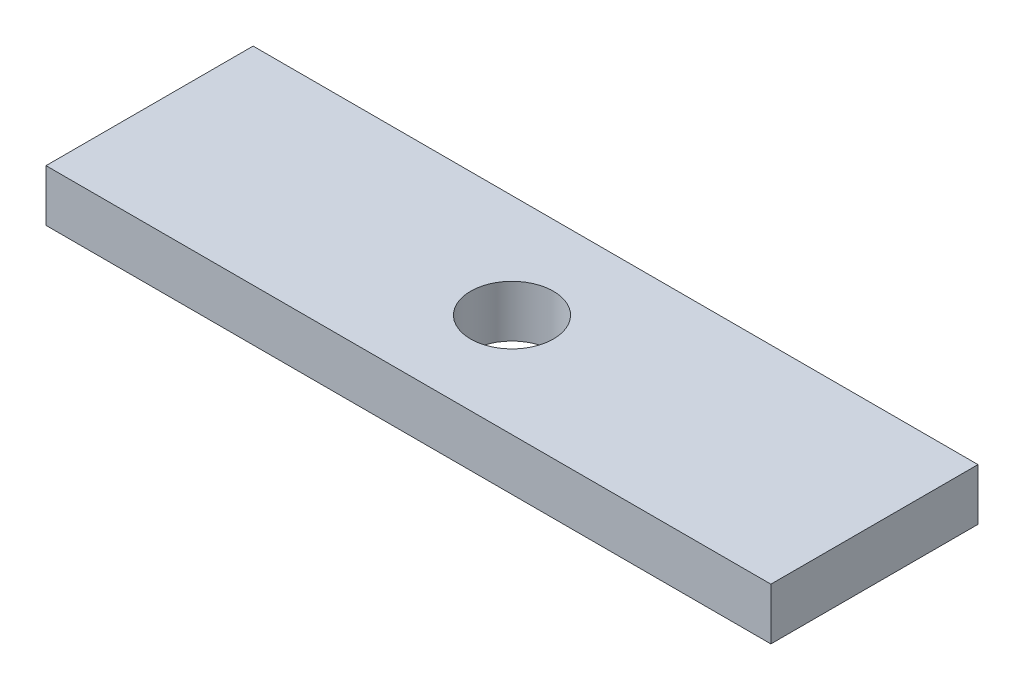
ISO-10303-21;
HEADER;
FILE_DESCRIPTION(('STEP AP214'),'2;1');
FILE_NAME('part.step','',(''),(''),'','','');
FILE_SCHEMA(('AUTOMOTIVE_DESIGN { 1 0 10303 214 1 1 1 1 }'));
ENDSEC;
DATA;
#1=APPLICATION_CONTEXT('core data for automotive mechanical design processes');
#2=APPLICATION_PROTOCOL_DEFINITION('international standard','automotive_design',2000,#1);
#3=PRODUCT_CONTEXT('',#1,'mechanical');
#4=PRODUCT('Part','Part','',(#3));
#5=PRODUCT_RELATED_PRODUCT_CATEGORY('part','',(#4));
#6=PRODUCT_DEFINITION_FORMATION('','',#4);
#7=PRODUCT_DEFINITION_CONTEXT('part definition',#1,'design');
#8=PRODUCT_DEFINITION('design','',#6,#7);
#9=PRODUCT_DEFINITION_SHAPE('','',#8);
#10=(LENGTH_UNIT() NAMED_UNIT(*) SI_UNIT(.MILLI.,.METRE.));
#11=(NAMED_UNIT(*) PLANE_ANGLE_UNIT() SI_UNIT($,.RADIAN.));
#12=(NAMED_UNIT(*) SI_UNIT($,.STERADIAN.) SOLID_ANGLE_UNIT());
#13=UNCERTAINTY_MEASURE_WITH_UNIT(LENGTH_MEASURE(1.E-05),#10,'distance_accuracy_value','');
#14=(GEOMETRIC_REPRESENTATION_CONTEXT(3) GLOBAL_UNCERTAINTY_ASSIGNED_CONTEXT((#13)) GLOBAL_UNIT_ASSIGNED_CONTEXT((#10,
#11,#12)) REPRESENTATION_CONTEXT('',''));
#15=CARTESIAN_POINT('',(0.,0.,0.));
#16=DIRECTION('',(0.,0.,1.));
#17=DIRECTION('',(1.,0.,0.));
#18=AXIS2_PLACEMENT_3D('',#15,#16,#17);
#19=CARTESIAN_POINT('',(0.,5.,0.));
#20=DIRECTION('',(0.,1.,0.));
#21=DIRECTION('',(0.,0.,1.));
#22=AXIS2_PLACEMENT_3D('',#19,#20,#21);
#23=PLANE('',#22);
#24=DIRECTION('',(0.,0.,-1.));
#25=VECTOR('',#24,1.);
#26=CARTESIAN_POINT('',(70.,5.,-20.));
#27=LINE('',#26,#25);
#28=CARTESIAN_POINT('',(70.,5.,20.));
#29=VERTEX_POINT('',#28);
#30=CARTESIAN_POINT('',(70.,5.,-20.));
#31=VERTEX_POINT('',#30);
#32=EDGE_CURVE('E87',#29,#31,#27,.T.);
#33=ORIENTED_EDGE('',*,*,#32,.T.);
#34=DIRECTION('',(-1.,0.,0.));
#35=VECTOR('',#34,1.);
#36=CARTESIAN_POINT('',(-70.,5.,-20.));
#37=LINE('',#36,#35);
#38=CARTESIAN_POINT('',(-70.,5.,-20.));
#39=VERTEX_POINT('',#38);
#40=EDGE_CURVE('E82',#31,#39,#37,.T.);
#41=ORIENTED_EDGE('',*,*,#40,.T.);
#42=DIRECTION('',(0.,0.,1.));
#43=VECTOR('',#42,1.);
#44=CARTESIAN_POINT('',(-70.,5.,-20.));
#45=LINE('',#44,#43);
#46=CARTESIAN_POINT('',(-70.,5.,20.));
#47=VERTEX_POINT('',#46);
#48=EDGE_CURVE('E85',#39,#47,#45,.T.);
#49=ORIENTED_EDGE('',*,*,#48,.T.);
#50=DIRECTION('',(1.,0.,0.));
#51=VECTOR('',#50,1.);
#52=CARTESIAN_POINT('',(-70.,5.,20.));
#53=LINE('',#52,#51);
#54=EDGE_CURVE('E52',#47,#29,#53,.T.);
#55=ORIENTED_EDGE('',*,*,#54,.T.);
#56=EDGE_LOOP('',(#33,#41,#49,#55));
#57=FACE_BOUND('',#56,.T.);
#58=CARTESIAN_POINT('',(0.,5.,0.));
#59=DIRECTION('',(0.,1.,0.));
#60=DIRECTION('',(0.,0.,1.));
#61=AXIS2_PLACEMENT_3D('',#58,#59,#60);
#62=CIRCLE('',#61,8.);
#63=CARTESIAN_POINT('',(0.,5.,7.99999999999999));
#64=VERTEX_POINT('',#63);
#65=EDGE_CURVE('E102',#64,#64,#62,.T.);
#66=ORIENTED_EDGE('',*,*,#65,.F.);
#67=EDGE_LOOP('',(#66));
#68=FACE_BOUND('',#67,.T.);
#69=ADVANCED_FACE('F35',(#57,#68),#23,.T.);
#70=CARTESIAN_POINT('',(0.,-5.,0.));
#71=DIRECTION('',(0.,1.,0.));
#72=DIRECTION('',(0.,0.,1.));
#73=AXIS2_PLACEMENT_3D('',#70,#71,#72);
#74=PLANE('',#73);
#75=DIRECTION('',(0.,0.,-1.));
#76=VECTOR('',#75,1.);
#77=CARTESIAN_POINT('',(70.,-5.,-20.));
#78=LINE('',#77,#76);
#79=CARTESIAN_POINT('',(70.,-5.,20.));
#80=VERTEX_POINT('',#79);
#81=CARTESIAN_POINT('',(70.,-5.,-20.));
#82=VERTEX_POINT('',#81);
#83=EDGE_CURVE('E99',#80,#82,#78,.T.);
#84=ORIENTED_EDGE('',*,*,#83,.F.);
#85=DIRECTION('',(1.,0.,0.));
#86=VECTOR('',#85,1.);
#87=CARTESIAN_POINT('',(-70.,-5.,20.));
#88=LINE('',#87,#86);
#89=CARTESIAN_POINT('',(-70.,-5.,20.));
#90=VERTEX_POINT('',#89);
#91=EDGE_CURVE('E75',#90,#80,#88,.T.);
#92=ORIENTED_EDGE('',*,*,#91,.F.);
#93=DIRECTION('',(0.,0.,1.));
#94=VECTOR('',#93,1.);
#95=CARTESIAN_POINT('',(-70.,-5.,-20.));
#96=LINE('',#95,#94);
#97=CARTESIAN_POINT('',(-70.,-5.,-20.));
#98=VERTEX_POINT('',#97);
#99=EDGE_CURVE('E69',#98,#90,#96,.T.);
#100=ORIENTED_EDGE('',*,*,#99,.F.);
#101=DIRECTION('',(-1.,0.,0.));
#102=VECTOR('',#101,1.);
#103=CARTESIAN_POINT('',(-70.,-5.,-20.));
#104=LINE('',#103,#102);
#105=EDGE_CURVE('E91',#82,#98,#104,.T.);
#106=ORIENTED_EDGE('',*,*,#105,.F.);
#107=EDGE_LOOP('',(#84,#92,#100,#106));
#108=FACE_BOUND('',#107,.T.);
#109=CARTESIAN_POINT('',(0.,-5.,0.));
#110=DIRECTION('',(0.,1.,0.));
#111=DIRECTION('',(0.,0.,1.));
#112=AXIS2_PLACEMENT_3D('',#109,#110,#111);
#113=CIRCLE('',#112,8.);
#114=CARTESIAN_POINT('',(0.,-5.,7.99999999999999));
#115=VERTEX_POINT('',#114);
#116=EDGE_CURVE('E114',#115,#115,#113,.T.);
#117=ORIENTED_EDGE('',*,*,#116,.T.);
#118=EDGE_LOOP('',(#117));
#119=FACE_BOUND('',#118,.T.);
#120=ADVANCED_FACE('F110',(#108,#119),#74,.F.);
#121=CARTESIAN_POINT('',(70.,5.,-20.));
#122=DIRECTION('',(-1.,0.,0.));
#123=DIRECTION('',(0.,0.,1.));
#124=AXIS2_PLACEMENT_3D('',#121,#122,#123);
#125=PLANE('',#124);
#126=ORIENTED_EDGE('',*,*,#83,.T.);
#127=DIRECTION('',(0.,-1.,0.));
#128=VECTOR('',#127,1.);
#129=CARTESIAN_POINT('',(70.,5.,-20.));
#130=LINE('',#129,#128);
#131=EDGE_CURVE('E11',#31,#82,#130,.T.);
#132=ORIENTED_EDGE('',*,*,#131,.F.);
#133=ORIENTED_EDGE('',*,*,#32,.F.);
#134=DIRECTION('',(0.,-1.,0.));
#135=VECTOR('',#134,1.);
#136=CARTESIAN_POINT('',(70.,5.,20.));
#137=LINE('',#136,#135);
#138=EDGE_CURVE('E95',#29,#80,#137,.T.);
#139=ORIENTED_EDGE('',*,*,#138,.T.);
#140=EDGE_LOOP('',(#126,#132,#133,#139));
#141=FACE_BOUND('',#140,.T.);
#142=ADVANCED_FACE('F37',(#141),#125,.F.);
#143=CARTESIAN_POINT('',(-70.,5.,-20.));
#144=DIRECTION('',(0.,0.,1.));
#145=DIRECTION('',(1.,0.,0.));
#146=AXIS2_PLACEMENT_3D('',#143,#144,#145);
#147=PLANE('',#146);
#148=ORIENTED_EDGE('',*,*,#105,.T.);
#149=DIRECTION('',(0.,-1.,0.));
#150=VECTOR('',#149,1.);
#151=CARTESIAN_POINT('',(-70.,5.,-20.));
#152=LINE('',#151,#150);
#153=EDGE_CURVE('E44',#39,#98,#152,.T.);
#154=ORIENTED_EDGE('',*,*,#153,.F.);
#155=ORIENTED_EDGE('',*,*,#40,.F.);
#156=ORIENTED_EDGE('',*,*,#131,.T.);
#157=EDGE_LOOP('',(#148,#154,#155,#156));
#158=FACE_BOUND('',#157,.T.);
#159=ADVANCED_FACE('F90',(#158),#147,.F.);
#160=CARTESIAN_POINT('',(-70.,5.,-20.));
#161=DIRECTION('',(1.,0.,0.));
#162=DIRECTION('',(0.,0.,-1.));
#163=AXIS2_PLACEMENT_3D('',#160,#161,#162);
#164=PLANE('',#163);
#165=ORIENTED_EDGE('',*,*,#99,.T.);
#166=DIRECTION('',(0.,-1.,0.));
#167=VECTOR('',#166,1.);
#168=CARTESIAN_POINT('',(-70.,5.,20.));
#169=LINE('',#168,#167);
#170=EDGE_CURVE('E92',#47,#90,#169,.T.);
#171=ORIENTED_EDGE('',*,*,#170,.F.);
#172=ORIENTED_EDGE('',*,*,#48,.F.);
#173=ORIENTED_EDGE('',*,*,#153,.T.);
#174=EDGE_LOOP('',(#165,#171,#172,#173));
#175=FACE_BOUND('',#174,.T.);
#176=ADVANCED_FACE('F93',(#175),#164,.F.);
#177=CARTESIAN_POINT('',(-70.,5.,20.));
#178=DIRECTION('',(0.,0.,-1.));
#179=DIRECTION('',(-1.,0.,0.));
#180=AXIS2_PLACEMENT_3D('',#177,#178,#179);
#181=PLANE('',#180);
#182=ORIENTED_EDGE('',*,*,#91,.T.);
#183=ORIENTED_EDGE('',*,*,#138,.F.);
#184=ORIENTED_EDGE('',*,*,#54,.F.);
#185=ORIENTED_EDGE('',*,*,#170,.T.);
#186=EDGE_LOOP('',(#182,#183,#184,#185));
#187=FACE_BOUND('',#186,.T.);
#188=ADVANCED_FACE('F107',(#187),#181,.F.);
#189=CARTESIAN_POINT('',(0.,5.,0.));
#190=DIRECTION('',(0.,-1.,0.));
#191=DIRECTION('',(0.,0.,-1.));
#192=AXIS2_PLACEMENT_3D('',#189,#190,#191);
#193=CYLINDRICAL_SURFACE('',#192,8.);
#194=ORIENTED_EDGE('',*,*,#65,.T.);
#195=EDGE_LOOP('',(#194));
#196=FACE_BOUND('',#195,.T.);
#197=ORIENTED_EDGE('',*,*,#116,.F.);
#198=EDGE_LOOP('',(#197));
#199=FACE_BOUND('',#198,.T.);
#200=ADVANCED_FACE('F120',(#196,#199),#193,.F.);
#201=CLOSED_SHELL('',(#69,#120,#142,#159,#176,#188,#200));
#202=MANIFOLD_SOLID_BREP('B2',#201);
#203=ADVANCED_BREP_SHAPE_REPRESENTATION('',(#18,#202),#14);
#204=SHAPE_DEFINITION_REPRESENTATION(#9,#203);
ENDSEC;
END-ISO-10303-21;
